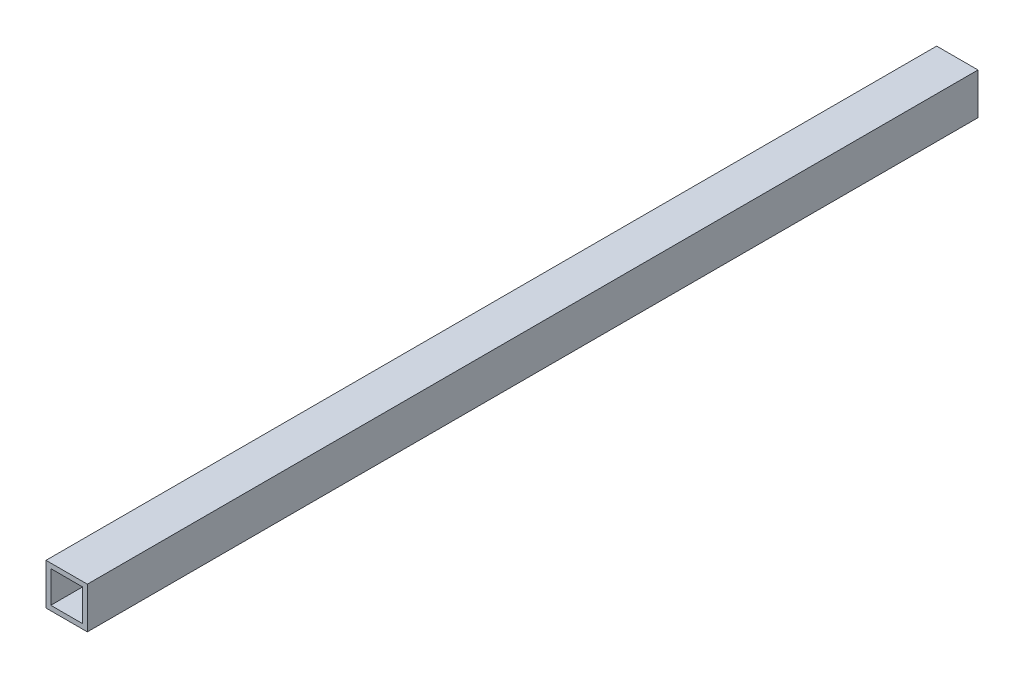
ISO-10303-21;
HEADER;
FILE_DESCRIPTION(('STEP AP214'),'2;1');
FILE_NAME('part.step','',(''),(''),'','','');
FILE_SCHEMA(('AUTOMOTIVE_DESIGN { 1 0 10303 214 1 1 1 1 }'));
ENDSEC;
DATA;
#1=APPLICATION_CONTEXT('core data for automotive mechanical design processes');
#2=APPLICATION_PROTOCOL_DEFINITION('international standard','automotive_design',2000,#1);
#3=PRODUCT_CONTEXT('',#1,'mechanical');
#4=PRODUCT('Part','Part','',(#3));
#5=PRODUCT_RELATED_PRODUCT_CATEGORY('part','',(#4));
#6=PRODUCT_DEFINITION_FORMATION('','',#4);
#7=PRODUCT_DEFINITION_CONTEXT('part definition',#1,'design');
#8=PRODUCT_DEFINITION('design','',#6,#7);
#9=PRODUCT_DEFINITION_SHAPE('','',#8);
#10=(LENGTH_UNIT() NAMED_UNIT(*) SI_UNIT(.MILLI.,.METRE.));
#11=(NAMED_UNIT(*) PLANE_ANGLE_UNIT() SI_UNIT($,.RADIAN.));
#12=(NAMED_UNIT(*) SI_UNIT($,.STERADIAN.) SOLID_ANGLE_UNIT());
#13=UNCERTAINTY_MEASURE_WITH_UNIT(LENGTH_MEASURE(1.E-05),#10,'distance_accuracy_value','');
#14=(GEOMETRIC_REPRESENTATION_CONTEXT(3) GLOBAL_UNCERTAINTY_ASSIGNED_CONTEXT((#13)) GLOBAL_UNIT_ASSIGNED_CONTEXT((#10,
#11,#12)) REPRESENTATION_CONTEXT('',''));
#15=CARTESIAN_POINT('',(0.,0.,0.));
#16=DIRECTION('',(0.,0.,1.));
#17=DIRECTION('',(1.,0.,0.));
#18=AXIS2_PLACEMENT_3D('',#15,#16,#17);
#19=CARTESIAN_POINT('',(0.,0.,280.));
#20=DIRECTION('',(0.,0.,1.));
#21=DIRECTION('',(1.,0.,0.));
#22=AXIS2_PLACEMENT_3D('',#19,#20,#21);
#23=PLANE('',#22);
#24=DIRECTION('',(0.,1.,0.));
#25=VECTOR('',#24,1.);
#26=CARTESIAN_POINT('',(6.5,6.5,280.));
#27=LINE('',#26,#25);
#28=CARTESIAN_POINT('',(6.5,-6.5,280.));
#29=VERTEX_POINT('',#28);
#30=CARTESIAN_POINT('',(6.5,6.5,280.));
#31=VERTEX_POINT('',#30);
#32=EDGE_CURVE('E136',#29,#31,#27,.T.);
#33=ORIENTED_EDGE('',*,*,#32,.T.);
#34=DIRECTION('',(-1.,0.,0.));
#35=VECTOR('',#34,1.);
#36=CARTESIAN_POINT('',(-6.5,6.5,280.));
#37=LINE('',#36,#35);
#38=CARTESIAN_POINT('',(-6.5,6.5,280.));
#39=VERTEX_POINT('',#38);
#40=EDGE_CURVE('E139',#31,#39,#37,.T.);
#41=ORIENTED_EDGE('',*,*,#40,.T.);
#42=DIRECTION('',(0.,-1.,0.));
#43=VECTOR('',#42,1.);
#44=CARTESIAN_POINT('',(-6.5,6.5,280.));
#45=LINE('',#44,#43);
#46=CARTESIAN_POINT('',(-6.5,-6.5,280.));
#47=VERTEX_POINT('',#46);
#48=EDGE_CURVE('E142',#39,#47,#45,.T.);
#49=ORIENTED_EDGE('',*,*,#48,.T.);
#50=DIRECTION('',(1.,0.,0.));
#51=VECTOR('',#50,1.);
#52=CARTESIAN_POINT('',(-6.5,-6.5,280.));
#53=LINE('',#52,#51);
#54=EDGE_CURVE('E144',#47,#29,#53,.T.);
#55=ORIENTED_EDGE('',*,*,#54,.T.);
#56=EDGE_LOOP('',(#33,#41,#49,#55));
#57=FACE_BOUND('',#56,.T.);
#58=DIRECTION('',(-1.,0.,0.));
#59=VECTOR('',#58,1.);
#60=CARTESIAN_POINT('',(-5.,5.00000000000001,280.));
#61=LINE('',#60,#59);
#62=CARTESIAN_POINT('',(5.,5.00000000000001,280.));
#63=VERTEX_POINT('',#62);
#64=CARTESIAN_POINT('',(-5.,5.00000000000001,280.));
#65=VERTEX_POINT('',#64);
#66=EDGE_CURVE('E108',#63,#65,#61,.T.);
#67=ORIENTED_EDGE('',*,*,#66,.F.);
#68=DIRECTION('',(0.,1.,0.));
#69=VECTOR('',#68,1.);
#70=CARTESIAN_POINT('',(5.,-5.,280.));
#71=LINE('',#70,#69);
#72=CARTESIAN_POINT('',(5.,-5.,280.));
#73=VERTEX_POINT('',#72);
#74=EDGE_CURVE('E100',#73,#63,#71,.T.);
#75=ORIENTED_EDGE('',*,*,#74,.F.);
#76=DIRECTION('',(1.,0.,0.));
#77=VECTOR('',#76,1.);
#78=CARTESIAN_POINT('',(-5.,-5.,280.));
#79=LINE('',#78,#77);
#80=CARTESIAN_POINT('',(-5.,-5.,280.));
#81=VERTEX_POINT('',#80);
#82=EDGE_CURVE('E122',#81,#73,#79,.T.);
#83=ORIENTED_EDGE('',*,*,#82,.F.);
#84=DIRECTION('',(0.,-1.,0.));
#85=VECTOR('',#84,1.);
#86=CARTESIAN_POINT('',(-5.,-5.,280.));
#87=LINE('',#86,#85);
#88=EDGE_CURVE('E120',#65,#81,#87,.T.);
#89=ORIENTED_EDGE('',*,*,#88,.F.);
#90=EDGE_LOOP('',(#67,#75,#83,#89));
#91=FACE_BOUND('',#90,.T.);
#92=ADVANCED_FACE('F35',(#57,#91),#23,.T.);
#93=CARTESIAN_POINT('',(0.,0.,0.));
#94=DIRECTION('',(0.,0.,1.));
#95=DIRECTION('',(1.,0.,0.));
#96=AXIS2_PLACEMENT_3D('',#93,#94,#95);
#97=PLANE('',#96);
#98=DIRECTION('',(0.,1.,0.));
#99=VECTOR('',#98,1.);
#100=CARTESIAN_POINT('',(6.5,6.5,0.));
#101=LINE('',#100,#99);
#102=CARTESIAN_POINT('',(6.5,-6.5,0.));
#103=VERTEX_POINT('',#102);
#104=CARTESIAN_POINT('',(6.5,6.5,0.));
#105=VERTEX_POINT('',#104);
#106=EDGE_CURVE('E116',#103,#105,#101,.T.);
#107=ORIENTED_EDGE('',*,*,#106,.F.);
#108=DIRECTION('',(1.,0.,0.));
#109=VECTOR('',#108,1.);
#110=CARTESIAN_POINT('',(-6.5,-6.5,0.));
#111=LINE('',#110,#109);
#112=CARTESIAN_POINT('',(-6.5,-6.5,0.));
#113=VERTEX_POINT('',#112);
#114=EDGE_CURVE('E140',#113,#103,#111,.T.);
#115=ORIENTED_EDGE('',*,*,#114,.F.);
#116=DIRECTION('',(0.,-1.,0.));
#117=VECTOR('',#116,1.);
#118=CARTESIAN_POINT('',(-6.5,6.5,0.));
#119=LINE('',#118,#117);
#120=CARTESIAN_POINT('',(-6.5,6.5,0.));
#121=VERTEX_POINT('',#120);
#122=EDGE_CURVE('E151',#121,#113,#119,.T.);
#123=ORIENTED_EDGE('',*,*,#122,.F.);
#124=DIRECTION('',(-1.,0.,0.));
#125=VECTOR('',#124,1.);
#126=CARTESIAN_POINT('',(-6.5,6.5,0.));
#127=LINE('',#126,#125);
#128=EDGE_CURVE('E149',#105,#121,#127,.T.);
#129=ORIENTED_EDGE('',*,*,#128,.F.);
#130=EDGE_LOOP('',(#107,#115,#123,#129));
#131=FACE_BOUND('',#130,.T.);
#132=DIRECTION('',(0.,1.,0.));
#133=VECTOR('',#132,1.);
#134=CARTESIAN_POINT('',(5.,-5.,0.));
#135=LINE('',#134,#133);
#136=CARTESIAN_POINT('',(5.,-5.,0.));
#137=VERTEX_POINT('',#136);
#138=CARTESIAN_POINT('',(5.,5.00000000000001,0.));
#139=VERTEX_POINT('',#138);
#140=EDGE_CURVE('E58',#137,#139,#135,.T.);
#141=ORIENTED_EDGE('',*,*,#140,.T.);
#142=DIRECTION('',(-1.,0.,0.));
#143=VECTOR('',#142,1.);
#144=CARTESIAN_POINT('',(-5.,5.00000000000001,0.));
#145=LINE('',#144,#143);
#146=CARTESIAN_POINT('',(-5.,5.00000000000001,0.));
#147=VERTEX_POINT('',#146);
#148=EDGE_CURVE('E115',#139,#147,#145,.T.);
#149=ORIENTED_EDGE('',*,*,#148,.T.);
#150=DIRECTION('',(0.,-1.,0.));
#151=VECTOR('',#150,1.);
#152=CARTESIAN_POINT('',(-5.,-5.,0.));
#153=LINE('',#152,#151);
#154=CARTESIAN_POINT('',(-5.,-5.,0.));
#155=VERTEX_POINT('',#154);
#156=EDGE_CURVE('E128',#147,#155,#153,.T.);
#157=ORIENTED_EDGE('',*,*,#156,.T.);
#158=DIRECTION('',(1.,0.,0.));
#159=VECTOR('',#158,1.);
#160=CARTESIAN_POINT('',(-5.,-5.,0.));
#161=LINE('',#160,#159);
#162=EDGE_CURVE('E109',#155,#137,#161,.T.);
#163=ORIENTED_EDGE('',*,*,#162,.T.);
#164=EDGE_LOOP('',(#141,#149,#157,#163));
#165=FACE_BOUND('',#164,.T.);
#166=ADVANCED_FACE('F169',(#131,#165),#97,.F.);
#167=CARTESIAN_POINT('',(6.5,6.5,280.));
#168=DIRECTION('',(-1.,0.,0.));
#169=DIRECTION('',(0.,0.,1.));
#170=AXIS2_PLACEMENT_3D('',#167,#168,#169);
#171=PLANE('',#170);
#172=ORIENTED_EDGE('',*,*,#106,.T.);
#173=DIRECTION('',(0.,0.,-1.));
#174=VECTOR('',#173,1.);
#175=CARTESIAN_POINT('',(6.5,6.5,280.));
#176=LINE('',#175,#174);
#177=EDGE_CURVE('E11',#31,#105,#176,.T.);
#178=ORIENTED_EDGE('',*,*,#177,.F.);
#179=ORIENTED_EDGE('',*,*,#32,.F.);
#180=DIRECTION('',(0.,0.,-1.));
#181=VECTOR('',#180,1.);
#182=CARTESIAN_POINT('',(6.5,-6.5,280.));
#183=LINE('',#182,#181);
#184=EDGE_CURVE('E146',#29,#103,#183,.T.);
#185=ORIENTED_EDGE('',*,*,#184,.T.);
#186=EDGE_LOOP('',(#172,#178,#179,#185));
#187=FACE_BOUND('',#186,.T.);
#188=ADVANCED_FACE('F37',(#187),#171,.F.);
#189=CARTESIAN_POINT('',(-6.5,6.5,280.));
#190=DIRECTION('',(0.,-1.,0.));
#191=DIRECTION('',(0.,0.,-1.));
#192=AXIS2_PLACEMENT_3D('',#189,#190,#191);
#193=PLANE('',#192);
#194=ORIENTED_EDGE('',*,*,#128,.T.);
#195=DIRECTION('',(0.,0.,-1.));
#196=VECTOR('',#195,1.);
#197=CARTESIAN_POINT('',(-6.5,6.5,280.));
#198=LINE('',#197,#196);
#199=EDGE_CURVE('E43',#39,#121,#198,.T.);
#200=ORIENTED_EDGE('',*,*,#199,.F.);
#201=ORIENTED_EDGE('',*,*,#40,.F.);
#202=ORIENTED_EDGE('',*,*,#177,.T.);
#203=EDGE_LOOP('',(#194,#200,#201,#202));
#204=FACE_BOUND('',#203,.T.);
#205=ADVANCED_FACE('F179',(#204),#193,.F.);
#206=CARTESIAN_POINT('',(-6.5,6.5,280.));
#207=DIRECTION('',(1.,0.,0.));
#208=DIRECTION('',(0.,0.,-1.));
#209=AXIS2_PLACEMENT_3D('',#206,#207,#208);
#210=PLANE('',#209);
#211=ORIENTED_EDGE('',*,*,#122,.T.);
#212=DIRECTION('',(0.,0.,-1.));
#213=VECTOR('',#212,1.);
#214=CARTESIAN_POINT('',(-6.5,-6.5,280.));
#215=LINE('',#214,#213);
#216=EDGE_CURVE('E156',#47,#113,#215,.T.);
#217=ORIENTED_EDGE('',*,*,#216,.F.);
#218=ORIENTED_EDGE('',*,*,#48,.F.);
#219=ORIENTED_EDGE('',*,*,#199,.T.);
#220=EDGE_LOOP('',(#211,#217,#218,#219));
#221=FACE_BOUND('',#220,.T.);
#222=ADVANCED_FACE('F163',(#221),#210,.F.);
#223=CARTESIAN_POINT('',(-6.5,-6.5,280.));
#224=DIRECTION('',(0.,1.,0.));
#225=DIRECTION('',(0.,0.,1.));
#226=AXIS2_PLACEMENT_3D('',#223,#224,#225);
#227=PLANE('',#226);
#228=ORIENTED_EDGE('',*,*,#114,.T.);
#229=ORIENTED_EDGE('',*,*,#184,.F.);
#230=ORIENTED_EDGE('',*,*,#54,.F.);
#231=ORIENTED_EDGE('',*,*,#216,.T.);
#232=EDGE_LOOP('',(#228,#229,#230,#231));
#233=FACE_BOUND('',#232,.T.);
#234=ADVANCED_FACE('F173',(#233),#227,.F.);
#235=CARTESIAN_POINT('',(5.,-5.,280.));
#236=DIRECTION('',(-1.,0.,0.));
#237=DIRECTION('',(0.,0.,1.));
#238=AXIS2_PLACEMENT_3D('',#235,#236,#237);
#239=PLANE('',#238);
#240=ORIENTED_EDGE('',*,*,#140,.F.);
#241=DIRECTION('',(0.,0.,-1.));
#242=VECTOR('',#241,1.);
#243=CARTESIAN_POINT('',(5.,-5.,280.));
#244=LINE('',#243,#242);
#245=EDGE_CURVE('E104',#73,#137,#244,.T.);
#246=ORIENTED_EDGE('',*,*,#245,.F.);
#247=ORIENTED_EDGE('',*,*,#74,.T.);
#248=DIRECTION('',(0.,0.,-1.));
#249=VECTOR('',#248,1.);
#250=CARTESIAN_POINT('',(5.,5.00000000000001,280.));
#251=LINE('',#250,#249);
#252=EDGE_CURVE('E103',#63,#139,#251,.T.);
#253=ORIENTED_EDGE('',*,*,#252,.T.);
#254=EDGE_LOOP('',(#240,#246,#247,#253));
#255=FACE_BOUND('',#254,.T.);
#256=ADVANCED_FACE('F102',(#255),#239,.T.);
#257=CARTESIAN_POINT('',(-5.,5.00000000000001,280.));
#258=DIRECTION('',(0.,-1.,0.));
#259=DIRECTION('',(0.,0.,-1.));
#260=AXIS2_PLACEMENT_3D('',#257,#258,#259);
#261=PLANE('',#260);
#262=ORIENTED_EDGE('',*,*,#148,.F.);
#263=ORIENTED_EDGE('',*,*,#252,.F.);
#264=ORIENTED_EDGE('',*,*,#66,.T.);
#265=DIRECTION('',(0.,0.,-1.));
#266=VECTOR('',#265,1.);
#267=CARTESIAN_POINT('',(-5.,5.00000000000001,280.));
#268=LINE('',#267,#266);
#269=EDGE_CURVE('E117',#65,#147,#268,.T.);
#270=ORIENTED_EDGE('',*,*,#269,.T.);
#271=EDGE_LOOP('',(#262,#263,#264,#270));
#272=FACE_BOUND('',#271,.T.);
#273=ADVANCED_FACE('F112',(#272),#261,.T.);
#274=CARTESIAN_POINT('',(-5.,-5.,280.));
#275=DIRECTION('',(1.,0.,0.));
#276=DIRECTION('',(0.,0.,-1.));
#277=AXIS2_PLACEMENT_3D('',#274,#275,#276);
#278=PLANE('',#277);
#279=ORIENTED_EDGE('',*,*,#156,.F.);
#280=ORIENTED_EDGE('',*,*,#269,.F.);
#281=ORIENTED_EDGE('',*,*,#88,.T.);
#282=DIRECTION('',(0.,0.,-1.));
#283=VECTOR('',#282,1.);
#284=CARTESIAN_POINT('',(-5.,-5.,280.));
#285=LINE('',#284,#283);
#286=EDGE_CURVE('E50',#81,#155,#285,.T.);
#287=ORIENTED_EDGE('',*,*,#286,.T.);
#288=EDGE_LOOP('',(#279,#280,#281,#287));
#289=FACE_BOUND('',#288,.T.);
#290=ADVANCED_FACE('F202',(#289),#278,.T.);
#291=CARTESIAN_POINT('',(-5.,-5.,280.));
#292=DIRECTION('',(0.,1.,0.));
#293=DIRECTION('',(0.,0.,1.));
#294=AXIS2_PLACEMENT_3D('',#291,#292,#293);
#295=PLANE('',#294);
#296=ORIENTED_EDGE('',*,*,#162,.F.);
#297=ORIENTED_EDGE('',*,*,#286,.F.);
#298=ORIENTED_EDGE('',*,*,#82,.T.);
#299=ORIENTED_EDGE('',*,*,#245,.T.);
#300=EDGE_LOOP('',(#296,#297,#298,#299));
#301=FACE_BOUND('',#300,.T.);
#302=ADVANCED_FACE('F206',(#301),#295,.T.);
#303=CLOSED_SHELL('',(#92,#166,#188,#205,#222,#234,#256,#273,#290,#302));
#304=MANIFOLD_SOLID_BREP('B2',#303);
#305=ADVANCED_BREP_SHAPE_REPRESENTATION('',(#18,#304),#14);
#306=SHAPE_DEFINITION_REPRESENTATION(#9,#305);
ENDSEC;
END-ISO-10303-21;
